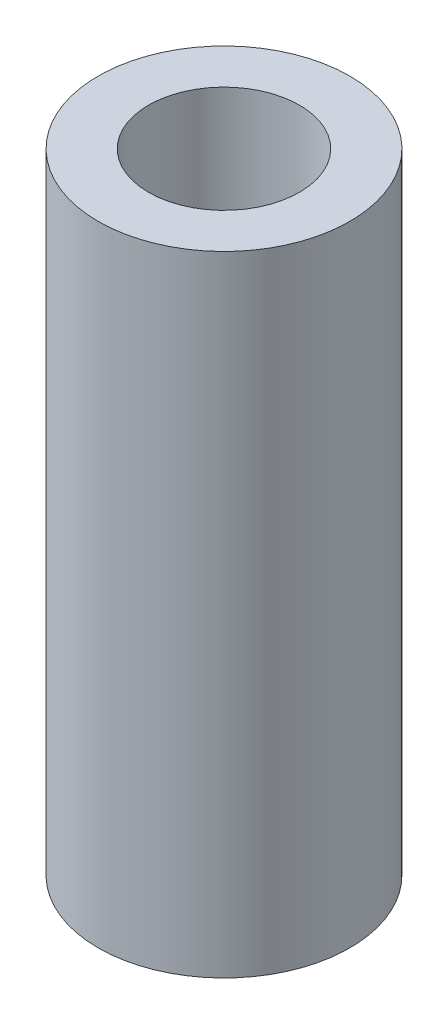
ISO-10303-21;
HEADER;
FILE_DESCRIPTION(('STEP AP214'),'2;1');
FILE_NAME('part.step','',(''),(''),'','','');
FILE_SCHEMA(('AUTOMOTIVE_DESIGN { 1 0 10303 214 1 1 1 1 }'));
ENDSEC;
DATA;
#1=APPLICATION_CONTEXT('core data for automotive mechanical design processes');
#2=APPLICATION_PROTOCOL_DEFINITION('international standard','automotive_design',2000,#1);
#3=PRODUCT_CONTEXT('',#1,'mechanical');
#4=PRODUCT('Part','Part','',(#3));
#5=PRODUCT_RELATED_PRODUCT_CATEGORY('part','',(#4));
#6=PRODUCT_DEFINITION_FORMATION('','',#4);
#7=PRODUCT_DEFINITION_CONTEXT('part definition',#1,'design');
#8=PRODUCT_DEFINITION('design','',#6,#7);
#9=PRODUCT_DEFINITION_SHAPE('','',#8);
#10=(LENGTH_UNIT() NAMED_UNIT(*) SI_UNIT(.MILLI.,.METRE.));
#11=(NAMED_UNIT(*) PLANE_ANGLE_UNIT() SI_UNIT($,.RADIAN.));
#12=(NAMED_UNIT(*) SI_UNIT($,.STERADIAN.) SOLID_ANGLE_UNIT());
#13=UNCERTAINTY_MEASURE_WITH_UNIT(LENGTH_MEASURE(1.E-05),#10,'distance_accuracy_value','');
#14=(GEOMETRIC_REPRESENTATION_CONTEXT(3) GLOBAL_UNCERTAINTY_ASSIGNED_CONTEXT((#13)) GLOBAL_UNIT_ASSIGNED_CONTEXT((#10,
#11,#12)) REPRESENTATION_CONTEXT('',''));
#15=CARTESIAN_POINT('',(0.,0.,0.));
#16=DIRECTION('',(0.,0.,1.));
#17=DIRECTION('',(1.,0.,0.));
#18=AXIS2_PLACEMENT_3D('',#15,#16,#17);
#19=CARTESIAN_POINT('',(0.,25.,0.));
#20=DIRECTION('',(0.,1.,0.));
#21=DIRECTION('',(0.,0.,1.));
#22=AXIS2_PLACEMENT_3D('',#19,#20,#21);
#23=PLANE('',#22);
#24=CARTESIAN_POINT('',(0.,25.,0.));
#25=DIRECTION('',(0.,1.,0.));
#26=DIRECTION('',(0.,0.,1.));
#27=AXIS2_PLACEMENT_3D('',#24,#25,#26);
#28=CIRCLE('',#27,5.);
#29=CARTESIAN_POINT('',(0.,25.,5.));
#30=VERTEX_POINT('',#29);
#31=EDGE_CURVE('E10',#30,#30,#28,.T.);
#32=ORIENTED_EDGE('',*,*,#31,.T.);
#33=EDGE_LOOP('',(#32));
#34=FACE_BOUND('',#33,.T.);
#35=CARTESIAN_POINT('',(0.,25.,0.));
#36=DIRECTION('',(0.,1.,0.));
#37=DIRECTION('',(0.,0.,1.));
#38=AXIS2_PLACEMENT_3D('',#35,#36,#37);
#39=CIRCLE('',#38,3.);
#40=CARTESIAN_POINT('',(0.,25.,3.));
#41=VERTEX_POINT('',#40);
#42=EDGE_CURVE('E50',#41,#41,#39,.T.);
#43=ORIENTED_EDGE('',*,*,#42,.F.);
#44=EDGE_LOOP('',(#43));
#45=FACE_BOUND('',#44,.T.);
#46=ADVANCED_FACE('F37',(#34,#45),#23,.T.);
#47=CARTESIAN_POINT('',(0.,0.,0.));
#48=DIRECTION('',(0.,1.,0.));
#49=DIRECTION('',(0.,0.,1.));
#50=AXIS2_PLACEMENT_3D('',#47,#48,#49);
#51=PLANE('',#50);
#52=CARTESIAN_POINT('',(0.,0.,0.));
#53=DIRECTION('',(0.,1.,0.));
#54=DIRECTION('',(0.,0.,1.));
#55=AXIS2_PLACEMENT_3D('',#52,#53,#54);
#56=CIRCLE('',#55,5.);
#57=CARTESIAN_POINT('',(0.,0.,5.));
#58=VERTEX_POINT('',#57);
#59=EDGE_CURVE('E41',#58,#58,#56,.T.);
#60=ORIENTED_EDGE('',*,*,#59,.F.);
#61=EDGE_LOOP('',(#60));
#62=FACE_BOUND('',#61,.T.);
#63=CARTESIAN_POINT('',(0.,0.,0.));
#64=DIRECTION('',(0.,1.,0.));
#65=DIRECTION('',(0.,0.,1.));
#66=AXIS2_PLACEMENT_3D('',#63,#64,#65);
#67=CIRCLE('',#66,3.);
#68=CARTESIAN_POINT('',(0.,0.,3.));
#69=VERTEX_POINT('',#68);
#70=EDGE_CURVE('E52',#69,#69,#67,.T.);
#71=ORIENTED_EDGE('',*,*,#70,.T.);
#72=EDGE_LOOP('',(#71));
#73=FACE_BOUND('',#72,.T.);
#74=ADVANCED_FACE('F64',(#62,#73),#51,.F.);
#75=CARTESIAN_POINT('',(0.,25.,0.));
#76=DIRECTION('',(0.,-1.,0.));
#77=DIRECTION('',(0.,0.,-1.));
#78=AXIS2_PLACEMENT_3D('',#75,#76,#77);
#79=CYLINDRICAL_SURFACE('',#78,5.);
#80=ORIENTED_EDGE('',*,*,#31,.F.);
#81=EDGE_LOOP('',(#80));
#82=FACE_BOUND('',#81,.T.);
#83=ORIENTED_EDGE('',*,*,#59,.T.);
#84=EDGE_LOOP('',(#83));
#85=FACE_BOUND('',#84,.T.);
#86=ADVANCED_FACE('F39',(#82,#85),#79,.T.);
#87=CARTESIAN_POINT('',(0.,25.,0.));
#88=DIRECTION('',(0.,-1.,0.));
#89=DIRECTION('',(0.,0.,-1.));
#90=AXIS2_PLACEMENT_3D('',#87,#88,#89);
#91=CYLINDRICAL_SURFACE('',#90,3.);
#92=ORIENTED_EDGE('',*,*,#42,.T.);
#93=EDGE_LOOP('',(#92));
#94=FACE_BOUND('',#93,.T.);
#95=ORIENTED_EDGE('',*,*,#70,.F.);
#96=EDGE_LOOP('',(#95));
#97=FACE_BOUND('',#96,.T.);
#98=ADVANCED_FACE('F60',(#94,#97),#91,.F.);
#99=CLOSED_SHELL('',(#46,#74,#86,#98));
#100=MANIFOLD_SOLID_BREP('B2',#99);
#101=ADVANCED_BREP_SHAPE_REPRESENTATION('',(#18,#100),#14);
#102=SHAPE_DEFINITION_REPRESENTATION(#9,#101);
ENDSEC;
END-ISO-10303-21;
